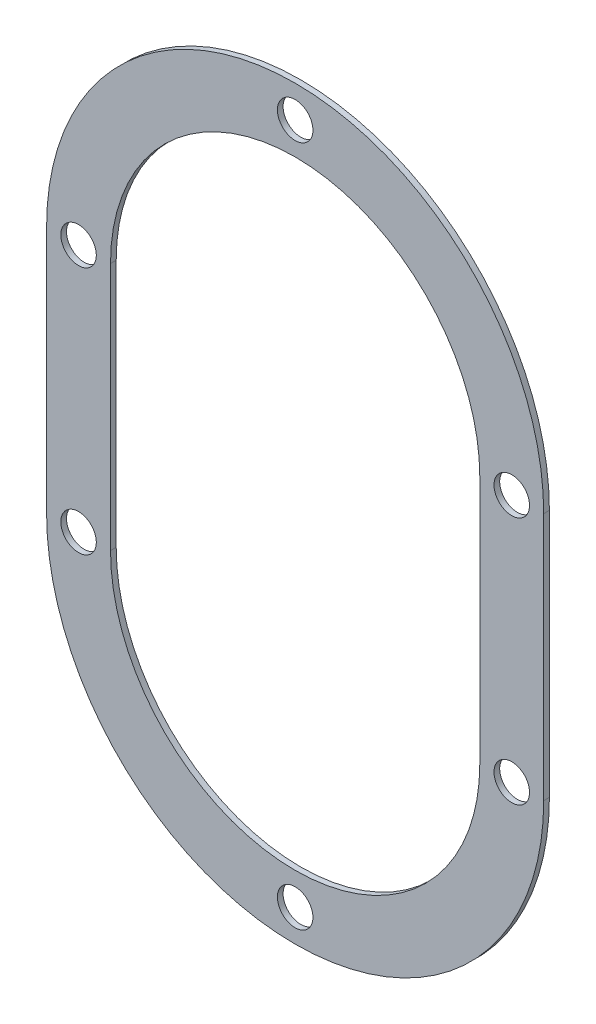
ISO-10303-21;
HEADER;
FILE_DESCRIPTION(('STEP AP214'),'2;1');
FILE_NAME('part.step','',(''),(''),'','','');
FILE_SCHEMA(('AUTOMOTIVE_DESIGN { 1 0 10303 214 1 1 1 1 }'));
ENDSEC;
DATA;
#1=APPLICATION_CONTEXT('core data for automotive mechanical design processes');
#2=APPLICATION_PROTOCOL_DEFINITION('international standard','automotive_design',2000,#1);
#3=PRODUCT_CONTEXT('',#1,'mechanical');
#4=PRODUCT('Part','Part','',(#3));
#5=PRODUCT_RELATED_PRODUCT_CATEGORY('part','',(#4));
#6=PRODUCT_DEFINITION_FORMATION('','',#4);
#7=PRODUCT_DEFINITION_CONTEXT('part definition',#1,'design');
#8=PRODUCT_DEFINITION('design','',#6,#7);
#9=PRODUCT_DEFINITION_SHAPE('','',#8);
#10=(LENGTH_UNIT() NAMED_UNIT(*) SI_UNIT(.MILLI.,.METRE.));
#11=(NAMED_UNIT(*) PLANE_ANGLE_UNIT() SI_UNIT($,.RADIAN.));
#12=(NAMED_UNIT(*) SI_UNIT($,.STERADIAN.) SOLID_ANGLE_UNIT());
#13=UNCERTAINTY_MEASURE_WITH_UNIT(LENGTH_MEASURE(1.E-05),#10,'distance_accuracy_value','');
#14=(GEOMETRIC_REPRESENTATION_CONTEXT(3) GLOBAL_UNCERTAINTY_ASSIGNED_CONTEXT((#13)) GLOBAL_UNIT_ASSIGNED_CONTEXT((#10,
#11,#12)) REPRESENTATION_CONTEXT('',''));
#15=CARTESIAN_POINT('',(0.,0.,0.));
#16=DIRECTION('',(0.,0.,1.));
#17=DIRECTION('',(1.,0.,0.));
#18=AXIS2_PLACEMENT_3D('',#15,#16,#17);
#19=CARTESIAN_POINT('',(0.,-11.942608695675,0.527026086956));
#20=DIRECTION('',(0.,0.,1.));
#21=DIRECTION('',(1.,0.,0.));
#22=AXIS2_PLACEMENT_3D('',#19,#20,#21);
#23=PLANE('',#22);
#24=CARTESIAN_POINT('',(0.,-32.74313043472,0.527026086956));
#25=DIRECTION('',(0.,0.,1.));
#26=DIRECTION('',(1.,0.,0.));
#27=AXIS2_PLACEMENT_3D('',#24,#25,#26);
#28=CIRCLE('',#27,0.793913043475);
#29=CARTESIAN_POINT('',(0.793913043474996,-32.74313043472,0.527026086956));
#30=VERTEX_POINT('',#29);
#31=EDGE_CURVE('E258',#30,#30,#28,.T.);
#32=ORIENTED_EDGE('',*,*,#31,.F.);
#33=EDGE_LOOP('',(#32));
#34=FACE_BOUND('',#33,.T.);
#35=CARTESIAN_POINT('',(9.685739130395,-11.942608695675,0.527026086956));
#36=DIRECTION('',(0.,0.,1.));
#37=DIRECTION('',(1.,0.,0.));
#38=AXIS2_PLACEMENT_3D('',#35,#36,#37);
#39=CIRCLE('',#38,0.793913043475);
#40=CARTESIAN_POINT('',(10.47965217387,-11.942608695675,0.527026086956));
#41=VERTEX_POINT('',#40);
#42=EDGE_CURVE('E270',#41,#41,#39,.T.);
#43=ORIENTED_EDGE('',*,*,#42,.F.);
#44=EDGE_LOOP('',(#43));
#45=FACE_BOUND('',#44,.T.);
#46=CARTESIAN_POINT('',(-9.685739130395,-11.942608695675,0.527026086956));
#47=DIRECTION('',(0.,0.,1.));
#48=DIRECTION('',(1.,0.,0.));
#49=AXIS2_PLACEMENT_3D('',#46,#47,#48);
#50=CIRCLE('',#49,0.793913043475);
#51=CARTESIAN_POINT('',(-8.89182608692,-11.942608695675,0.527026086956));
#52=VERTEX_POINT('',#51);
#53=EDGE_CURVE('E132',#52,#52,#50,.T.);
#54=ORIENTED_EDGE('',*,*,#53,.F.);
#55=EDGE_LOOP('',(#54));
#56=FACE_BOUND('',#55,.T.);
#57=CARTESIAN_POINT('',(0.,-11.942608695675,0.527026086956));
#58=DIRECTION('',(0.,0.,1.));
#59=DIRECTION('',(1.,0.,0.));
#60=AXIS2_PLACEMENT_3D('',#57,#58,#59);
#61=CIRCLE('',#60,11.11478260865);
#62=CARTESIAN_POINT('',(11.11478260865,-11.942608695675,0.527026086956));
#63=VERTEX_POINT('',#62);
#64=CARTESIAN_POINT('',(-11.11478260865,-11.942608695675,0.527026086956));
#65=VERTEX_POINT('',#64);
#66=EDGE_CURVE('E142',#63,#65,#61,.T.);
#67=ORIENTED_EDGE('',*,*,#66,.T.);
#68=DIRECTION('',(0.,-1.,0.));
#69=VECTOR('',#68,1.);
#70=CARTESIAN_POINT('',(-11.11478260865,-11.942608695675,0.527026086956));
#71=LINE('',#70,#69);
#72=CARTESIAN_POINT('',(-11.11478260865,-23.057391304325,0.527026086956));
#73=VERTEX_POINT('',#72);
#74=EDGE_CURVE('E145',#65,#73,#71,.T.);
#75=ORIENTED_EDGE('',*,*,#74,.T.);
#76=CARTESIAN_POINT('',(0.,-23.057391304325,0.527026086956));
#77=DIRECTION('',(0.,0.,1.));
#78=DIRECTION('',(1.,0.,0.));
#79=AXIS2_PLACEMENT_3D('',#76,#77,#78);
#80=CIRCLE('',#79,11.11478260865);
#81=CARTESIAN_POINT('',(11.11478260865,-23.057391304325,0.527026086956));
#82=VERTEX_POINT('',#81);
#83=EDGE_CURVE('E148',#73,#82,#80,.T.);
#84=ORIENTED_EDGE('',*,*,#83,.T.);
#85=DIRECTION('',(0.,1.,0.));
#86=VECTOR('',#85,1.);
#87=CARTESIAN_POINT('',(11.11478260865,-11.942608695675,0.527026086956));
#88=LINE('',#87,#86);
#89=EDGE_CURVE('E150',#82,#63,#88,.T.);
#90=ORIENTED_EDGE('',*,*,#89,.T.);
#91=EDGE_LOOP('',(#67,#75,#84,#90));
#92=FACE_BOUND('',#91,.T.);
#93=DIRECTION('',(0.,-1.,0.));
#94=VECTOR('',#93,1.);
#95=CARTESIAN_POINT('',(-8.25669565214,-11.942608695675,0.527026086956));
#96=LINE('',#95,#94);
#97=CARTESIAN_POINT('',(-8.25669565214,-11.942608695675,0.527026086956));
#98=VERTEX_POINT('',#97);
#99=CARTESIAN_POINT('',(-8.25669565214,-23.057391304325,0.527026086956));
#100=VERTEX_POINT('',#99);
#101=EDGE_CURVE('E111',#98,#100,#96,.T.);
#102=ORIENTED_EDGE('',*,*,#101,.F.);
#103=CARTESIAN_POINT('',(0.,-11.942608695675,0.527026086956));
#104=DIRECTION('',(0.,0.,1.));
#105=DIRECTION('',(1.,0.,0.));
#106=AXIS2_PLACEMENT_3D('',#103,#104,#105);
#107=CIRCLE('',#106,8.25669565214);
#108=CARTESIAN_POINT('',(8.25669565214,-11.942608695675,0.527026086956));
#109=VERTEX_POINT('',#108);
#110=EDGE_CURVE('E103',#109,#98,#107,.T.);
#111=ORIENTED_EDGE('',*,*,#110,.F.);
#112=DIRECTION('',(0.,1.,0.));
#113=VECTOR('',#112,1.);
#114=CARTESIAN_POINT('',(8.25669565214,-11.942608695675,0.527026086956));
#115=LINE('',#114,#113);
#116=CARTESIAN_POINT('',(8.25669565214,-23.057391304325,0.527026086956));
#117=VERTEX_POINT('',#116);
#118=EDGE_CURVE('E126',#117,#109,#115,.T.);
#119=ORIENTED_EDGE('',*,*,#118,.F.);
#120=CARTESIAN_POINT('',(0.,-23.057391304325,0.527026086956));
#121=DIRECTION('',(0.,0.,1.));
#122=DIRECTION('',(1.,0.,0.));
#123=AXIS2_PLACEMENT_3D('',#120,#121,#122);
#124=CIRCLE('',#123,8.25669565214);
#125=EDGE_CURVE('E124',#100,#117,#124,.T.);
#126=ORIENTED_EDGE('',*,*,#125,.F.);
#127=EDGE_LOOP('',(#102,#111,#119,#126));
#128=FACE_BOUND('',#127,.T.);
#129=CARTESIAN_POINT('',(0.,-2.25686956527999,0.527026086956));
#130=DIRECTION('',(0.,0.,1.));
#131=DIRECTION('',(1.,0.,0.));
#132=AXIS2_PLACEMENT_3D('',#129,#130,#131);
#133=CIRCLE('',#132,0.793913043475);
#134=CARTESIAN_POINT('',(0.793913043474999,-2.25686956527999,0.527026086956));
#135=VERTEX_POINT('',#134);
#136=EDGE_CURVE('E276',#135,#135,#133,.T.);
#137=ORIENTED_EDGE('',*,*,#136,.F.);
#138=EDGE_LOOP('',(#137));
#139=FACE_BOUND('',#138,.T.);
#140=CARTESIAN_POINT('',(9.685739130395,-23.057391304325,0.527026086956));
#141=DIRECTION('',(0.,0.,1.));
#142=DIRECTION('',(1.,0.,0.));
#143=AXIS2_PLACEMENT_3D('',#140,#141,#142);
#144=CIRCLE('',#143,0.793913043475);
#145=CARTESIAN_POINT('',(10.47965217387,-23.057391304325,0.527026086956));
#146=VERTEX_POINT('',#145);
#147=EDGE_CURVE('E264',#146,#146,#144,.T.);
#148=ORIENTED_EDGE('',*,*,#147,.F.);
#149=EDGE_LOOP('',(#148));
#150=FACE_BOUND('',#149,.T.);
#151=CARTESIAN_POINT('',(-9.685739130395,-23.057391304325,0.527026086956));
#152=DIRECTION('',(0.,0.,1.));
#153=DIRECTION('',(1.,0.,0.));
#154=AXIS2_PLACEMENT_3D('',#151,#152,#153);
#155=CIRCLE('',#154,0.793913043475);
#156=CARTESIAN_POINT('',(-8.89182608692,-23.057391304325,0.527026086956));
#157=VERTEX_POINT('',#156);
#158=EDGE_CURVE('E249',#157,#157,#155,.T.);
#159=ORIENTED_EDGE('',*,*,#158,.F.);
#160=EDGE_LOOP('',(#159));
#161=FACE_BOUND('',#160,.T.);
#162=ADVANCED_FACE('F38',(#34,#45,#56,#92,#128,#139,#150,#161),#23,.T.);
#163=CARTESIAN_POINT('',(0.,-11.942608695675,0.272973913044));
#164=DIRECTION('',(0.,0.,1.));
#165=DIRECTION('',(1.,0.,0.));
#166=AXIS2_PLACEMENT_3D('',#163,#164,#165);
#167=PLANE('',#166);
#168=CARTESIAN_POINT('',(0.,-11.942608695675,0.272973913044));
#169=DIRECTION('',(0.,0.,1.));
#170=DIRECTION('',(1.,0.,0.));
#171=AXIS2_PLACEMENT_3D('',#168,#169,#170);
#172=CIRCLE('',#171,11.11478260865);
#173=CARTESIAN_POINT('',(11.11478260865,-11.942608695675,0.272973913044));
#174=VERTEX_POINT('',#173);
#175=CARTESIAN_POINT('',(-11.11478260865,-11.942608695675,0.272973913044));
#176=VERTEX_POINT('',#175);
#177=EDGE_CURVE('E119',#174,#176,#172,.T.);
#178=ORIENTED_EDGE('',*,*,#177,.F.);
#179=DIRECTION('',(0.,1.,0.));
#180=VECTOR('',#179,1.);
#181=CARTESIAN_POINT('',(11.11478260865,-11.942608695675,0.272973913044));
#182=LINE('',#181,#180);
#183=CARTESIAN_POINT('',(11.11478260865,-23.057391304325,0.272973913044));
#184=VERTEX_POINT('',#183);
#185=EDGE_CURVE('E146',#184,#174,#182,.T.);
#186=ORIENTED_EDGE('',*,*,#185,.F.);
#187=CARTESIAN_POINT('',(0.,-23.057391304325,0.272973913044));
#188=DIRECTION('',(0.,0.,1.));
#189=DIRECTION('',(1.,0.,0.));
#190=AXIS2_PLACEMENT_3D('',#187,#188,#189);
#191=CIRCLE('',#190,11.11478260865);
#192=CARTESIAN_POINT('',(-11.11478260865,-23.057391304325,0.272973913044));
#193=VERTEX_POINT('',#192);
#194=EDGE_CURVE('E157',#193,#184,#191,.T.);
#195=ORIENTED_EDGE('',*,*,#194,.F.);
#196=DIRECTION('',(0.,-1.,0.));
#197=VECTOR('',#196,1.);
#198=CARTESIAN_POINT('',(-11.11478260865,-11.942608695675,0.272973913044));
#199=LINE('',#198,#197);
#200=EDGE_CURVE('E155',#176,#193,#199,.T.);
#201=ORIENTED_EDGE('',*,*,#200,.F.);
#202=EDGE_LOOP('',(#178,#186,#195,#201));
#203=FACE_BOUND('',#202,.T.);
#204=CARTESIAN_POINT('',(0.,-11.942608695675,0.272973913044));
#205=DIRECTION('',(0.,0.,1.));
#206=DIRECTION('',(1.,0.,0.));
#207=AXIS2_PLACEMENT_3D('',#204,#205,#206);
#208=CIRCLE('',#207,8.25669565214);
#209=CARTESIAN_POINT('',(8.25669565214,-11.942608695675,0.272973913044));
#210=VERTEX_POINT('',#209);
#211=CARTESIAN_POINT('',(-8.25669565214,-11.942608695675,0.272973913044));
#212=VERTEX_POINT('',#211);
#213=EDGE_CURVE('E61',#210,#212,#208,.T.);
#214=ORIENTED_EDGE('',*,*,#213,.T.);
#215=DIRECTION('',(0.,-1.,0.));
#216=VECTOR('',#215,1.);
#217=CARTESIAN_POINT('',(-8.25669565214,-11.942608695675,0.272973913044));
#218=LINE('',#217,#216);
#219=CARTESIAN_POINT('',(-8.25669565214,-23.057391304325,0.272973913044));
#220=VERTEX_POINT('',#219);
#221=EDGE_CURVE('E118',#212,#220,#218,.T.);
#222=ORIENTED_EDGE('',*,*,#221,.T.);
#223=CARTESIAN_POINT('',(0.,-23.057391304325,0.272973913044));
#224=DIRECTION('',(0.,0.,1.));
#225=DIRECTION('',(1.,0.,0.));
#226=AXIS2_PLACEMENT_3D('',#223,#224,#225);
#227=CIRCLE('',#226,8.25669565214);
#228=CARTESIAN_POINT('',(8.25669565214,-23.057391304325,0.272973913044));
#229=VERTEX_POINT('',#228);
#230=EDGE_CURVE('E134',#220,#229,#227,.T.);
#231=ORIENTED_EDGE('',*,*,#230,.T.);
#232=DIRECTION('',(0.,1.,0.));
#233=VECTOR('',#232,1.);
#234=CARTESIAN_POINT('',(8.25669565214,-11.942608695675,0.272973913044));
#235=LINE('',#234,#233);
#236=EDGE_CURVE('E112',#229,#210,#235,.T.);
#237=ORIENTED_EDGE('',*,*,#236,.T.);
#238=EDGE_LOOP('',(#214,#222,#231,#237));
#239=FACE_BOUND('',#238,.T.);
#240=CARTESIAN_POINT('',(-9.685739130395,-11.942608695675,0.272973913044));
#241=DIRECTION('',(0.,0.,1.));
#242=DIRECTION('',(1.,0.,0.));
#243=AXIS2_PLACEMENT_3D('',#240,#241,#242);
#244=CIRCLE('',#243,0.793913043475);
#245=CARTESIAN_POINT('',(-8.89182608692,-11.942608695675,0.272973913044));
#246=VERTEX_POINT('',#245);
#247=EDGE_CURVE('E279',#246,#246,#244,.T.);
#248=ORIENTED_EDGE('',*,*,#247,.T.);
#249=EDGE_LOOP('',(#248));
#250=FACE_BOUND('',#249,.T.);
#251=CARTESIAN_POINT('',(0.,-2.25686956527999,0.272973913044));
#252=DIRECTION('',(0.,0.,1.));
#253=DIRECTION('',(1.,0.,0.));
#254=AXIS2_PLACEMENT_3D('',#251,#252,#253);
#255=CIRCLE('',#254,0.793913043475);
#256=CARTESIAN_POINT('',(0.793913043474999,-2.25686956527999,0.272973913044));
#257=VERTEX_POINT('',#256);
#258=EDGE_CURVE('E273',#257,#257,#255,.T.);
#259=ORIENTED_EDGE('',*,*,#258,.T.);
#260=EDGE_LOOP('',(#259));
#261=FACE_BOUND('',#260,.T.);
#262=CARTESIAN_POINT('',(9.685739130395,-11.942608695675,0.272973913044));
#263=DIRECTION('',(0.,0.,1.));
#264=DIRECTION('',(1.,0.,0.));
#265=AXIS2_PLACEMENT_3D('',#262,#263,#264);
#266=CIRCLE('',#265,0.793913043475);
#267=CARTESIAN_POINT('',(10.47965217387,-11.942608695675,0.272973913044));
#268=VERTEX_POINT('',#267);
#269=EDGE_CURVE('E267',#268,#268,#266,.T.);
#270=ORIENTED_EDGE('',*,*,#269,.T.);
#271=EDGE_LOOP('',(#270));
#272=FACE_BOUND('',#271,.T.);
#273=CARTESIAN_POINT('',(9.685739130395,-23.057391304325,0.272973913044));
#274=DIRECTION('',(0.,0.,1.));
#275=DIRECTION('',(1.,0.,0.));
#276=AXIS2_PLACEMENT_3D('',#273,#274,#275);
#277=CIRCLE('',#276,0.793913043475);
#278=CARTESIAN_POINT('',(10.47965217387,-23.057391304325,0.272973913044));
#279=VERTEX_POINT('',#278);
#280=EDGE_CURVE('E261',#279,#279,#277,.T.);
#281=ORIENTED_EDGE('',*,*,#280,.T.);
#282=EDGE_LOOP('',(#281));
#283=FACE_BOUND('',#282,.T.);
#284=CARTESIAN_POINT('',(0.,-32.74313043472,0.272973913044));
#285=DIRECTION('',(0.,0.,1.));
#286=DIRECTION('',(1.,0.,0.));
#287=AXIS2_PLACEMENT_3D('',#284,#285,#286);
#288=CIRCLE('',#287,0.793913043475);
#289=CARTESIAN_POINT('',(0.793913043474996,-32.74313043472,0.272973913044));
#290=VERTEX_POINT('',#289);
#291=EDGE_CURVE('E255',#290,#290,#288,.T.);
#292=ORIENTED_EDGE('',*,*,#291,.T.);
#293=EDGE_LOOP('',(#292));
#294=FACE_BOUND('',#293,.T.);
#295=CARTESIAN_POINT('',(-9.685739130395,-23.057391304325,0.272973913044));
#296=DIRECTION('',(0.,0.,1.));
#297=DIRECTION('',(1.,0.,0.));
#298=AXIS2_PLACEMENT_3D('',#295,#296,#297);
#299=CIRCLE('',#298,0.793913043475);
#300=CARTESIAN_POINT('',(-8.89182608692,-23.057391304325,0.272973913044));
#301=VERTEX_POINT('',#300);
#302=EDGE_CURVE('E252',#301,#301,#299,.T.);
#303=ORIENTED_EDGE('',*,*,#302,.T.);
#304=EDGE_LOOP('',(#303));
#305=FACE_BOUND('',#304,.T.);
#306=ADVANCED_FACE('F175',(#203,#239,#250,#261,#272,#283,#294,#305),#167,.F.);
#307=CARTESIAN_POINT('',(0.,-11.942608695675,0.527026086956));
#308=DIRECTION('',(0.,0.,-1.));
#309=DIRECTION('',(-1.,0.,0.));
#310=AXIS2_PLACEMENT_3D('',#307,#308,#309);
#311=CYLINDRICAL_SURFACE('',#310,11.11478260865);
#312=ORIENTED_EDGE('',*,*,#177,.T.);
#313=DIRECTION('',(0.,0.,-1.));
#314=VECTOR('',#313,1.);
#315=CARTESIAN_POINT('',(-11.11478260865,-11.942608695675,0.527026086956));
#316=LINE('',#315,#314);
#317=EDGE_CURVE('E11',#65,#176,#316,.T.);
#318=ORIENTED_EDGE('',*,*,#317,.F.);
#319=ORIENTED_EDGE('',*,*,#66,.F.);
#320=DIRECTION('',(0.,0.,-1.));
#321=VECTOR('',#320,1.);
#322=CARTESIAN_POINT('',(11.11478260865,-11.942608695675,0.527026086956));
#323=LINE('',#322,#321);
#324=EDGE_CURVE('E152',#63,#174,#323,.T.);
#325=ORIENTED_EDGE('',*,*,#324,.T.);
#326=EDGE_LOOP('',(#312,#318,#319,#325));
#327=FACE_BOUND('',#326,.T.);
#328=ADVANCED_FACE('F40',(#327),#311,.T.);
#329=CARTESIAN_POINT('',(-11.11478260865,-11.942608695675,0.527026086956));
#330=DIRECTION('',(1.,0.,0.));
#331=DIRECTION('',(0.,1.,0.));
#332=AXIS2_PLACEMENT_3D('',#329,#330,#331);
#333=PLANE('',#332);
#334=ORIENTED_EDGE('',*,*,#200,.T.);
#335=DIRECTION('',(0.,0.,-1.));
#336=VECTOR('',#335,1.);
#337=CARTESIAN_POINT('',(-11.11478260865,-23.057391304325,0.527026086956));
#338=LINE('',#337,#336);
#339=EDGE_CURVE('E46',#73,#193,#338,.T.);
#340=ORIENTED_EDGE('',*,*,#339,.F.);
#341=ORIENTED_EDGE('',*,*,#74,.F.);
#342=ORIENTED_EDGE('',*,*,#317,.T.);
#343=EDGE_LOOP('',(#334,#340,#341,#342));
#344=FACE_BOUND('',#343,.T.);
#345=ADVANCED_FACE('F185',(#344),#333,.F.);
#346=CARTESIAN_POINT('',(0.,-23.057391304325,0.527026086956));
#347=DIRECTION('',(0.,0.,-1.));
#348=DIRECTION('',(-1.,0.,0.));
#349=AXIS2_PLACEMENT_3D('',#346,#347,#348);
#350=CYLINDRICAL_SURFACE('',#349,11.11478260865);
#351=ORIENTED_EDGE('',*,*,#194,.T.);
#352=DIRECTION('',(0.,0.,-1.));
#353=VECTOR('',#352,1.);
#354=CARTESIAN_POINT('',(11.11478260865,-23.057391304325,0.527026086956));
#355=LINE('',#354,#353);
#356=EDGE_CURVE('E162',#82,#184,#355,.T.);
#357=ORIENTED_EDGE('',*,*,#356,.F.);
#358=ORIENTED_EDGE('',*,*,#83,.F.);
#359=ORIENTED_EDGE('',*,*,#339,.T.);
#360=EDGE_LOOP('',(#351,#357,#358,#359));
#361=FACE_BOUND('',#360,.T.);
#362=ADVANCED_FACE('F169',(#361),#350,.T.);
#363=CARTESIAN_POINT('',(11.11478260865,-11.942608695675,0.527026086956));
#364=DIRECTION('',(-1.,0.,0.));
#365=DIRECTION('',(0.,-1.,0.));
#366=AXIS2_PLACEMENT_3D('',#363,#364,#365);
#367=PLANE('',#366);
#368=ORIENTED_EDGE('',*,*,#185,.T.);
#369=ORIENTED_EDGE('',*,*,#324,.F.);
#370=ORIENTED_EDGE('',*,*,#89,.F.);
#371=ORIENTED_EDGE('',*,*,#356,.T.);
#372=EDGE_LOOP('',(#368,#369,#370,#371));
#373=FACE_BOUND('',#372,.T.);
#374=ADVANCED_FACE('F179',(#373),#367,.F.);
#375=CARTESIAN_POINT('',(0.,-11.942608695675,0.527026086956));
#376=DIRECTION('',(0.,0.,-1.));
#377=DIRECTION('',(-1.,0.,0.));
#378=AXIS2_PLACEMENT_3D('',#375,#376,#377);
#379=CYLINDRICAL_SURFACE('',#378,8.25669565214);
#380=ORIENTED_EDGE('',*,*,#213,.F.);
#381=DIRECTION('',(0.,0.,-1.));
#382=VECTOR('',#381,1.);
#383=CARTESIAN_POINT('',(8.25669565214,-11.942608695675,0.527026086956));
#384=LINE('',#383,#382);
#385=EDGE_CURVE('E107',#109,#210,#384,.T.);
#386=ORIENTED_EDGE('',*,*,#385,.F.);
#387=ORIENTED_EDGE('',*,*,#110,.T.);
#388=DIRECTION('',(0.,0.,-1.));
#389=VECTOR('',#388,1.);
#390=CARTESIAN_POINT('',(-8.25669565214,-11.942608695675,0.527026086956));
#391=LINE('',#390,#389);
#392=EDGE_CURVE('E106',#98,#212,#391,.T.);
#393=ORIENTED_EDGE('',*,*,#392,.T.);
#394=EDGE_LOOP('',(#380,#386,#387,#393));
#395=FACE_BOUND('',#394,.T.);
#396=ADVANCED_FACE('F105',(#395),#379,.F.);
#397=CARTESIAN_POINT('',(-8.25669565214,-11.942608695675,0.527026086956));
#398=DIRECTION('',(1.,0.,0.));
#399=DIRECTION('',(0.,0.,-1.));
#400=AXIS2_PLACEMENT_3D('',#397,#398,#399);
#401=PLANE('',#400);
#402=ORIENTED_EDGE('',*,*,#221,.F.);
#403=ORIENTED_EDGE('',*,*,#392,.F.);
#404=ORIENTED_EDGE('',*,*,#101,.T.);
#405=DIRECTION('',(0.,0.,-1.));
#406=VECTOR('',#405,1.);
#407=CARTESIAN_POINT('',(-8.25669565214,-23.057391304325,0.527026086956));
#408=LINE('',#407,#406);
#409=EDGE_CURVE('E120',#100,#220,#408,.T.);
#410=ORIENTED_EDGE('',*,*,#409,.T.);
#411=EDGE_LOOP('',(#402,#403,#404,#410));
#412=FACE_BOUND('',#411,.T.);
#413=ADVANCED_FACE('F115',(#412),#401,.T.);
#414=CARTESIAN_POINT('',(0.,-23.057391304325,0.527026086956));
#415=DIRECTION('',(0.,0.,-1.));
#416=DIRECTION('',(-1.,0.,0.));
#417=AXIS2_PLACEMENT_3D('',#414,#415,#416);
#418=CYLINDRICAL_SURFACE('',#417,8.25669565214);
#419=ORIENTED_EDGE('',*,*,#230,.F.);
#420=ORIENTED_EDGE('',*,*,#409,.F.);
#421=ORIENTED_EDGE('',*,*,#125,.T.);
#422=DIRECTION('',(0.,0.,-1.));
#423=VECTOR('',#422,1.);
#424=CARTESIAN_POINT('',(8.25669565214,-23.057391304325,0.527026086956));
#425=LINE('',#424,#423);
#426=EDGE_CURVE('E53',#117,#229,#425,.T.);
#427=ORIENTED_EDGE('',*,*,#426,.T.);
#428=EDGE_LOOP('',(#419,#420,#421,#427));
#429=FACE_BOUND('',#428,.T.);
#430=ADVANCED_FACE('F211',(#429),#418,.F.);
#431=CARTESIAN_POINT('',(8.25669565214,-11.942608695675,0.527026086956));
#432=DIRECTION('',(-1.,0.,0.));
#433=DIRECTION('',(0.,-1.,0.));
#434=AXIS2_PLACEMENT_3D('',#431,#432,#433);
#435=PLANE('',#434);
#436=ORIENTED_EDGE('',*,*,#236,.F.);
#437=ORIENTED_EDGE('',*,*,#426,.F.);
#438=ORIENTED_EDGE('',*,*,#118,.T.);
#439=ORIENTED_EDGE('',*,*,#385,.T.);
#440=EDGE_LOOP('',(#436,#437,#438,#439));
#441=FACE_BOUND('',#440,.T.);
#442=ADVANCED_FACE('F215',(#441),#435,.T.);
#443=CARTESIAN_POINT('',(-9.685739130395,-11.942608695675,0.527026086956));
#444=DIRECTION('',(0.,0.,-1.));
#445=DIRECTION('',(-1.,0.,0.));
#446=AXIS2_PLACEMENT_3D('',#443,#444,#445);
#447=CYLINDRICAL_SURFACE('',#446,0.793913043475);
#448=ORIENTED_EDGE('',*,*,#53,.T.);
#449=EDGE_LOOP('',(#448));
#450=FACE_BOUND('',#449,.T.);
#451=ORIENTED_EDGE('',*,*,#247,.F.);
#452=EDGE_LOOP('',(#451));
#453=FACE_BOUND('',#452,.T.);
#454=ADVANCED_FACE('F221',(#450,#453),#447,.F.);
#455=CARTESIAN_POINT('',(0.,-2.25686956527999,0.527026086956));
#456=DIRECTION('',(0.,0.,-1.));
#457=DIRECTION('',(-1.,0.,0.));
#458=AXIS2_PLACEMENT_3D('',#455,#456,#457);
#459=CYLINDRICAL_SURFACE('',#458,0.793913043475);
#460=ORIENTED_EDGE('',*,*,#136,.T.);
#461=EDGE_LOOP('',(#460));
#462=FACE_BOUND('',#461,.T.);
#463=ORIENTED_EDGE('',*,*,#258,.F.);
#464=EDGE_LOOP('',(#463));
#465=FACE_BOUND('',#464,.T.);
#466=ADVANCED_FACE('F224',(#462,#465),#459,.F.);
#467=CARTESIAN_POINT('',(9.685739130395,-11.942608695675,0.527026086956));
#468=DIRECTION('',(0.,0.,-1.));
#469=DIRECTION('',(-1.,0.,0.));
#470=AXIS2_PLACEMENT_3D('',#467,#468,#469);
#471=CYLINDRICAL_SURFACE('',#470,0.793913043475);
#472=ORIENTED_EDGE('',*,*,#42,.T.);
#473=EDGE_LOOP('',(#472));
#474=FACE_BOUND('',#473,.T.);
#475=ORIENTED_EDGE('',*,*,#269,.F.);
#476=EDGE_LOOP('',(#475));
#477=FACE_BOUND('',#476,.T.);
#478=ADVANCED_FACE('F228',(#474,#477),#471,.F.);
#479=CARTESIAN_POINT('',(9.685739130395,-23.057391304325,0.527026086956));
#480=DIRECTION('',(0.,0.,-1.));
#481=DIRECTION('',(-1.,0.,0.));
#482=AXIS2_PLACEMENT_3D('',#479,#480,#481);
#483=CYLINDRICAL_SURFACE('',#482,0.793913043475);
#484=ORIENTED_EDGE('',*,*,#147,.T.);
#485=EDGE_LOOP('',(#484));
#486=FACE_BOUND('',#485,.T.);
#487=ORIENTED_EDGE('',*,*,#280,.F.);
#488=EDGE_LOOP('',(#487));
#489=FACE_BOUND('',#488,.T.);
#490=ADVANCED_FACE('F232',(#486,#489),#483,.F.);
#491=CARTESIAN_POINT('',(0.,-32.74313043472,0.527026086956));
#492=DIRECTION('',(0.,0.,-1.));
#493=DIRECTION('',(-1.,0.,0.));
#494=AXIS2_PLACEMENT_3D('',#491,#492,#493);
#495=CYLINDRICAL_SURFACE('',#494,0.793913043475);
#496=ORIENTED_EDGE('',*,*,#31,.T.);
#497=EDGE_LOOP('',(#496));
#498=FACE_BOUND('',#497,.T.);
#499=ORIENTED_EDGE('',*,*,#291,.F.);
#500=EDGE_LOOP('',(#499));
#501=FACE_BOUND('',#500,.T.);
#502=ADVANCED_FACE('F236',(#498,#501),#495,.F.);
#503=CARTESIAN_POINT('',(-9.685739130395,-23.057391304325,0.527026086956));
#504=DIRECTION('',(0.,0.,-1.));
#505=DIRECTION('',(-1.,0.,0.));
#506=AXIS2_PLACEMENT_3D('',#503,#504,#505);
#507=CYLINDRICAL_SURFACE('',#506,0.793913043475);
#508=ORIENTED_EDGE('',*,*,#158,.T.);
#509=EDGE_LOOP('',(#508));
#510=FACE_BOUND('',#509,.T.);
#511=ORIENTED_EDGE('',*,*,#302,.F.);
#512=EDGE_LOOP('',(#511));
#513=FACE_BOUND('',#512,.T.);
#514=ADVANCED_FACE('F240',(#510,#513),#507,.F.);
#515=CLOSED_SHELL('',(#162,#306,#328,#345,#362,#374,#396,#413,#430,#442,#454,#466,#478,#490,
#502,#514));
#516=MANIFOLD_SOLID_BREP('B2',#515);
#517=ADVANCED_BREP_SHAPE_REPRESENTATION('',(#18,#516),#14);
#518=SHAPE_DEFINITION_REPRESENTATION(#9,#517);
ENDSEC;
END-ISO-10303-21;
